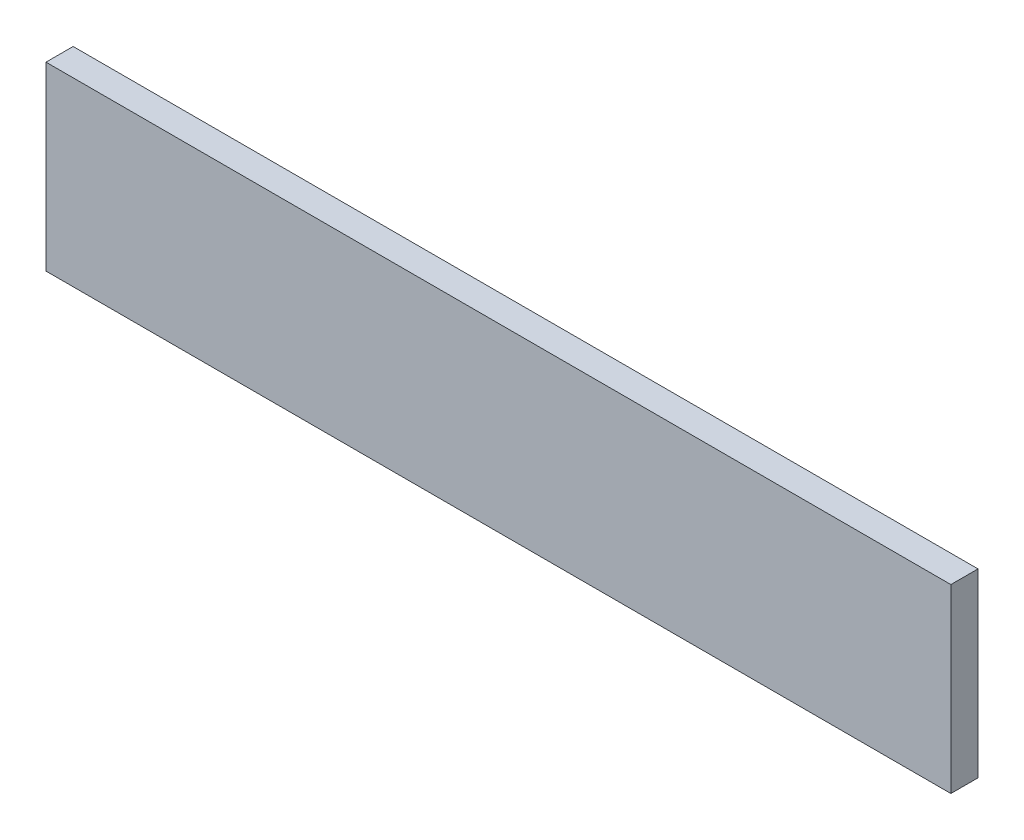
ISO-10303-21;
HEADER;
FILE_DESCRIPTION(('STEP AP214'),'2;1');
FILE_NAME('part.step','',(''),(''),'','','');
FILE_SCHEMA(('AUTOMOTIVE_DESIGN { 1 0 10303 214 1 1 1 1 }'));
ENDSEC;
DATA;
#1=APPLICATION_CONTEXT('core data for automotive mechanical design processes');
#2=APPLICATION_PROTOCOL_DEFINITION('international standard','automotive_design',2000,#1);
#3=PRODUCT_CONTEXT('',#1,'mechanical');
#4=PRODUCT('Part','Part','',(#3));
#5=PRODUCT_RELATED_PRODUCT_CATEGORY('part','',(#4));
#6=PRODUCT_DEFINITION_FORMATION('','',#4);
#7=PRODUCT_DEFINITION_CONTEXT('part definition',#1,'design');
#8=PRODUCT_DEFINITION('design','',#6,#7);
#9=PRODUCT_DEFINITION_SHAPE('','',#8);
#10=(LENGTH_UNIT() NAMED_UNIT(*) SI_UNIT(.MILLI.,.METRE.));
#11=(NAMED_UNIT(*) PLANE_ANGLE_UNIT() SI_UNIT($,.RADIAN.));
#12=(NAMED_UNIT(*) SI_UNIT($,.STERADIAN.) SOLID_ANGLE_UNIT());
#13=UNCERTAINTY_MEASURE_WITH_UNIT(LENGTH_MEASURE(1.E-05),#10,'distance_accuracy_value','');
#14=(GEOMETRIC_REPRESENTATION_CONTEXT(3) GLOBAL_UNCERTAINTY_ASSIGNED_CONTEXT((#13)) GLOBAL_UNIT_ASSIGNED_CONTEXT((#10,
#11,#12)) REPRESENTATION_CONTEXT('',''));
#15=CARTESIAN_POINT('',(0.,0.,0.));
#16=DIRECTION('',(0.,0.,1.));
#17=DIRECTION('',(1.,0.,0.));
#18=AXIS2_PLACEMENT_3D('',#15,#16,#17);
#19=CARTESIAN_POINT('',(100.,-20.,6.));
#20=DIRECTION('',(-1.,0.,0.));
#21=DIRECTION('',(0.,0.,1.));
#22=AXIS2_PLACEMENT_3D('',#19,#20,#21);
#23=PLANE('',#22);
#24=DIRECTION('',(0.,1.,0.));
#25=VECTOR('',#24,1.);
#26=CARTESIAN_POINT('',(100.,-20.,0.));
#27=LINE('',#26,#25);
#28=CARTESIAN_POINT('',(100.,-20.,0.));
#29=VERTEX_POINT('',#28);
#30=CARTESIAN_POINT('',(100.,20.,0.));
#31=VERTEX_POINT('',#30);
#32=EDGE_CURVE('E95',#29,#31,#27,.T.);
#33=ORIENTED_EDGE('',*,*,#32,.T.);
#34=DIRECTION('',(0.,0.,-1.));
#35=VECTOR('',#34,1.);
#36=CARTESIAN_POINT('',(100.,20.,6.));
#37=LINE('',#36,#35);
#38=CARTESIAN_POINT('',(100.,20.,6.));
#39=VERTEX_POINT('',#38);
#40=EDGE_CURVE('E11',#39,#31,#37,.T.);
#41=ORIENTED_EDGE('',*,*,#40,.F.);
#42=DIRECTION('',(0.,1.,0.));
#43=VECTOR('',#42,1.);
#44=CARTESIAN_POINT('',(100.,-20.,6.));
#45=LINE('',#44,#43);
#46=CARTESIAN_POINT('',(100.,-20.,6.));
#47=VERTEX_POINT('',#46);
#48=EDGE_CURVE('E83',#47,#39,#45,.T.);
#49=ORIENTED_EDGE('',*,*,#48,.F.);
#50=DIRECTION('',(0.,0.,-1.));
#51=VECTOR('',#50,1.);
#52=CARTESIAN_POINT('',(100.,-20.,6.));
#53=LINE('',#52,#51);
#54=EDGE_CURVE('E91',#47,#29,#53,.T.);
#55=ORIENTED_EDGE('',*,*,#54,.T.);
#56=EDGE_LOOP('',(#33,#41,#49,#55));
#57=FACE_BOUND('',#56,.T.);
#58=ADVANCED_FACE('F32',(#57),#23,.F.);
#59=CARTESIAN_POINT('',(-100.,20.,6.));
#60=DIRECTION('',(0.,-1.,0.));
#61=DIRECTION('',(0.,0.,-1.));
#62=AXIS2_PLACEMENT_3D('',#59,#60,#61);
#63=PLANE('',#62);
#64=DIRECTION('',(-1.,0.,0.));
#65=VECTOR('',#64,1.);
#66=CARTESIAN_POINT('',(-100.,20.,0.));
#67=LINE('',#66,#65);
#68=CARTESIAN_POINT('',(-100.,20.,0.));
#69=VERTEX_POINT('',#68);
#70=EDGE_CURVE('E87',#31,#69,#67,.T.);
#71=ORIENTED_EDGE('',*,*,#70,.T.);
#72=DIRECTION('',(0.,0.,-1.));
#73=VECTOR('',#72,1.);
#74=CARTESIAN_POINT('',(-100.,20.,6.));
#75=LINE('',#74,#73);
#76=CARTESIAN_POINT('',(-100.,20.,6.));
#77=VERTEX_POINT('',#76);
#78=EDGE_CURVE('E40',#77,#69,#75,.T.);
#79=ORIENTED_EDGE('',*,*,#78,.F.);
#80=DIRECTION('',(-1.,0.,0.));
#81=VECTOR('',#80,1.);
#82=CARTESIAN_POINT('',(-100.,20.,6.));
#83=LINE('',#82,#81);
#84=EDGE_CURVE('E78',#39,#77,#83,.T.);
#85=ORIENTED_EDGE('',*,*,#84,.F.);
#86=ORIENTED_EDGE('',*,*,#40,.T.);
#87=EDGE_LOOP('',(#71,#79,#85,#86));
#88=FACE_BOUND('',#87,.T.);
#89=ADVANCED_FACE('F86',(#88),#63,.F.);
#90=CARTESIAN_POINT('',(-100.,-20.,6.));
#91=DIRECTION('',(1.,0.,0.));
#92=DIRECTION('',(0.,0.,-1.));
#93=AXIS2_PLACEMENT_3D('',#90,#91,#92);
#94=PLANE('',#93);
#95=DIRECTION('',(0.,-1.,0.));
#96=VECTOR('',#95,1.);
#97=CARTESIAN_POINT('',(-100.,-20.,0.));
#98=LINE('',#97,#96);
#99=CARTESIAN_POINT('',(-100.,-20.,0.));
#100=VERTEX_POINT('',#99);
#101=EDGE_CURVE('E65',#69,#100,#98,.T.);
#102=ORIENTED_EDGE('',*,*,#101,.T.);
#103=DIRECTION('',(0.,0.,-1.));
#104=VECTOR('',#103,1.);
#105=CARTESIAN_POINT('',(-100.,-20.,6.));
#106=LINE('',#105,#104);
#107=CARTESIAN_POINT('',(-100.,-20.,6.));
#108=VERTEX_POINT('',#107);
#109=EDGE_CURVE('E88',#108,#100,#106,.T.);
#110=ORIENTED_EDGE('',*,*,#109,.F.);
#111=DIRECTION('',(0.,-1.,0.));
#112=VECTOR('',#111,1.);
#113=CARTESIAN_POINT('',(-100.,-20.,6.));
#114=LINE('',#113,#112);
#115=EDGE_CURVE('E81',#77,#108,#114,.T.);
#116=ORIENTED_EDGE('',*,*,#115,.F.);
#117=ORIENTED_EDGE('',*,*,#78,.T.);
#118=EDGE_LOOP('',(#102,#110,#116,#117));
#119=FACE_BOUND('',#118,.T.);
#120=ADVANCED_FACE('F89',(#119),#94,.F.);
#121=CARTESIAN_POINT('',(-100.,-20.,6.));
#122=DIRECTION('',(0.,1.,0.));
#123=DIRECTION('',(0.,0.,1.));
#124=AXIS2_PLACEMENT_3D('',#121,#122,#123);
#125=PLANE('',#124);
#126=DIRECTION('',(1.,0.,0.));
#127=VECTOR('',#126,1.);
#128=CARTESIAN_POINT('',(-100.,-20.,0.));
#129=LINE('',#128,#127);
#130=EDGE_CURVE('E71',#100,#29,#129,.T.);
#131=ORIENTED_EDGE('',*,*,#130,.T.);
#132=ORIENTED_EDGE('',*,*,#54,.F.);
#133=DIRECTION('',(1.,0.,0.));
#134=VECTOR('',#133,1.);
#135=CARTESIAN_POINT('',(-100.,-20.,6.));
#136=LINE('',#135,#134);
#137=EDGE_CURVE('E48',#108,#47,#136,.T.);
#138=ORIENTED_EDGE('',*,*,#137,.F.);
#139=ORIENTED_EDGE('',*,*,#109,.T.);
#140=EDGE_LOOP('',(#131,#132,#138,#139));
#141=FACE_BOUND('',#140,.T.);
#142=ADVANCED_FACE('F102',(#141),#125,.F.);
#143=CARTESIAN_POINT('',(0.,0.,6.));
#144=DIRECTION('',(0.,0.,-1.));
#145=DIRECTION('',(-1.,0.,0.));
#146=AXIS2_PLACEMENT_3D('',#143,#144,#145);
#147=PLANE('',#146);
#148=ORIENTED_EDGE('',*,*,#48,.T.);
#149=ORIENTED_EDGE('',*,*,#84,.T.);
#150=ORIENTED_EDGE('',*,*,#115,.T.);
#151=ORIENTED_EDGE('',*,*,#137,.T.);
#152=EDGE_LOOP('',(#148,#149,#150,#151));
#153=FACE_BOUND('',#152,.T.);
#154=ADVANCED_FACE('F79',(#153),#147,.F.);
#155=CARTESIAN_POINT('',(0.,0.,0.));
#156=DIRECTION('',(0.,0.,-1.));
#157=DIRECTION('',(-1.,0.,0.));
#158=AXIS2_PLACEMENT_3D('',#155,#156,#157);
#159=PLANE('',#158);
#160=ORIENTED_EDGE('',*,*,#32,.F.);
#161=ORIENTED_EDGE('',*,*,#130,.F.);
#162=ORIENTED_EDGE('',*,*,#101,.F.);
#163=ORIENTED_EDGE('',*,*,#70,.F.);
#164=EDGE_LOOP('',(#160,#161,#162,#163));
#165=FACE_BOUND('',#164,.T.);
#166=ADVANCED_FACE('F105',(#165),#159,.T.);
#167=CLOSED_SHELL('',(#58,#89,#120,#142,#154,#166));
#168=MANIFOLD_SOLID_BREP('B2',#167);
#169=ADVANCED_BREP_SHAPE_REPRESENTATION('',(#18,#168),#14);
#170=SHAPE_DEFINITION_REPRESENTATION(#9,#169);
ENDSEC;
END-ISO-10303-21;
